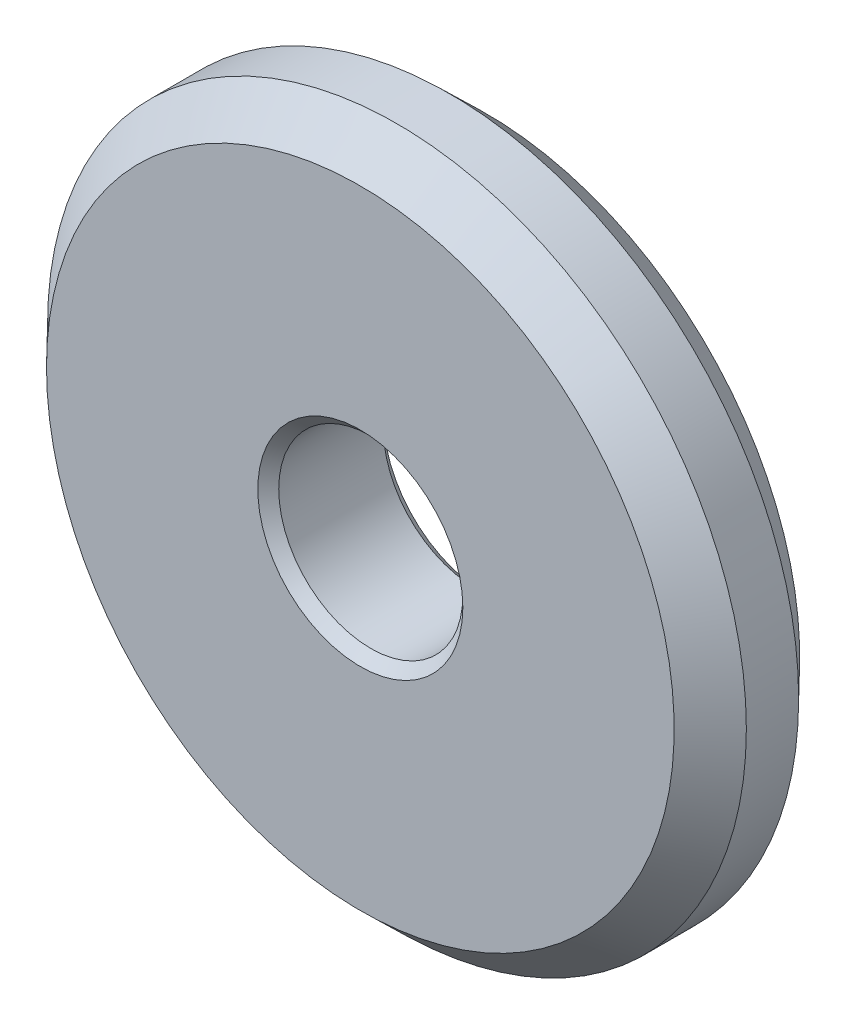
ISO-10303-21;
HEADER;
FILE_DESCRIPTION(('STEP AP214'),'2;1');
FILE_NAME('part.step','',(''),(''),'','','');
FILE_SCHEMA(('AUTOMOTIVE_DESIGN { 1 0 10303 214 1 1 1 1 }'));
ENDSEC;
DATA;
#1=APPLICATION_CONTEXT('core data for automotive mechanical design processes');
#2=APPLICATION_PROTOCOL_DEFINITION('international standard','automotive_design',2000,#1);
#3=PRODUCT_CONTEXT('',#1,'mechanical');
#4=PRODUCT('Part','Part','',(#3));
#5=PRODUCT_RELATED_PRODUCT_CATEGORY('part','',(#4));
#6=PRODUCT_DEFINITION_FORMATION('','',#4);
#7=PRODUCT_DEFINITION_CONTEXT('part definition',#1,'design');
#8=PRODUCT_DEFINITION('design','',#6,#7);
#9=PRODUCT_DEFINITION_SHAPE('','',#8);
#10=(LENGTH_UNIT() NAMED_UNIT(*) SI_UNIT(.MILLI.,.METRE.));
#11=(NAMED_UNIT(*) PLANE_ANGLE_UNIT() SI_UNIT($,.RADIAN.));
#12=(NAMED_UNIT(*) SI_UNIT($,.STERADIAN.) SOLID_ANGLE_UNIT());
#13=UNCERTAINTY_MEASURE_WITH_UNIT(LENGTH_MEASURE(1.E-05),#10,'distance_accuracy_value','');
#14=(GEOMETRIC_REPRESENTATION_CONTEXT(3) GLOBAL_UNCERTAINTY_ASSIGNED_CONTEXT((#13)) GLOBAL_UNIT_ASSIGNED_CONTEXT((#10,
#11,#12)) REPRESENTATION_CONTEXT('',''));
#15=CARTESIAN_POINT('',(0.,0.,0.));
#16=DIRECTION('',(0.,0.,1.));
#17=DIRECTION('',(1.,0.,0.));
#18=AXIS2_PLACEMENT_3D('',#15,#16,#17);
#19=CARTESIAN_POINT('',(0.,0.,0.));
#20=DIRECTION('',(0.,0.,-1.));
#21=DIRECTION('',(-1.,0.,0.));
#22=AXIS2_PLACEMENT_3D('',#19,#20,#21);
#23=CYLINDRICAL_SURFACE('',#22,4.4);
#24=CARTESIAN_POINT('',(0.,0.,5.5));
#25=DIRECTION('',(0.,0.,1.));
#26=DIRECTION('',(1.,0.,0.));
#27=AXIS2_PLACEMENT_3D('',#24,#25,#26);
#28=CIRCLE('',#27,4.4);
#29=CARTESIAN_POINT('',(4.4,0.,5.5));
#30=VERTEX_POINT('',#29);
#31=EDGE_CURVE('E46',#30,#30,#28,.T.);
#32=ORIENTED_EDGE('',*,*,#31,.T.);
#33=EDGE_LOOP('',(#32));
#34=FACE_BOUND('',#33,.T.);
#35=CARTESIAN_POINT('',(0.,0.,0.500000000000001));
#36=DIRECTION('',(0.,0.,-1.));
#37=DIRECTION('',(-1.,0.,0.));
#38=AXIS2_PLACEMENT_3D('',#35,#36,#37);
#39=CIRCLE('',#38,4.4);
#40=CARTESIAN_POINT('',(-4.4,0.,0.500000000000001));
#41=VERTEX_POINT('',#40);
#42=EDGE_CURVE('E50',#41,#41,#39,.T.);
#43=ORIENTED_EDGE('',*,*,#42,.T.);
#44=EDGE_LOOP('',(#43));
#45=FACE_BOUND('',#44,.T.);
#46=ADVANCED_FACE('F39',(#34,#45),#23,.F.);
#47=CARTESIAN_POINT('',(0.,4.4,0.));
#48=DIRECTION('',(0.,0.,-1.));
#49=DIRECTION('',(-1.,0.,0.));
#50=AXIS2_PLACEMENT_3D('',#47,#48,#49);
#51=PLANE('',#50);
#52=CARTESIAN_POINT('',(0.,0.,0.));
#53=DIRECTION('',(0.,0.,-1.));
#54=DIRECTION('',(-1.,0.,0.));
#55=AXIS2_PLACEMENT_3D('',#52,#53,#54);
#56=CIRCLE('',#55,4.9);
#57=CARTESIAN_POINT('',(-4.9,0.,0.));
#58=VERTEX_POINT('',#57);
#59=EDGE_CURVE('E10',#58,#58,#56,.F.);
#60=ORIENTED_EDGE('',*,*,#59,.T.);
#61=EDGE_LOOP('',(#60));
#62=FACE_BOUND('',#61,.T.);
#63=CARTESIAN_POINT('',(0.,0.,0.));
#64=DIRECTION('',(0.,0.,-1.));
#65=DIRECTION('',(-1.,0.,0.));
#66=AXIS2_PLACEMENT_3D('',#63,#64,#65);
#67=CIRCLE('',#66,15.);
#68=CARTESIAN_POINT('',(-15.,0.,0.));
#69=VERTEX_POINT('',#68);
#70=EDGE_CURVE('E59',#69,#69,#67,.T.);
#71=ORIENTED_EDGE('',*,*,#70,.T.);
#72=EDGE_LOOP('',(#71));
#73=FACE_BOUND('',#72,.T.);
#74=ADVANCED_FACE('F89',(#62,#73),#51,.T.);
#75=CARTESIAN_POINT('',(0.,0.,0.));
#76=DIRECTION('',(0.,0.,1.));
#77=DIRECTION('',(1.,0.,0.));
#78=AXIS2_PLACEMENT_3D('',#75,#76,#77);
#79=CONICAL_SURFACE('',#78,15.,0.770906424331948);
#80=CARTESIAN_POINT('',(0.,0.,1.75));
#81=DIRECTION('',(0.,0.,-1.));
#82=DIRECTION('',(-1.,0.,0.));
#83=AXIS2_PLACEMENT_3D('',#80,#81,#82);
#84=CIRCLE('',#83,16.7);
#85=CARTESIAN_POINT('',(-16.7,0.,1.75));
#86=VERTEX_POINT('',#85);
#87=EDGE_CURVE('E62',#86,#86,#84,.T.);
#88=ORIENTED_EDGE('',*,*,#87,.T.);
#89=EDGE_LOOP('',(#88));
#90=FACE_BOUND('',#89,.T.);
#91=ORIENTED_EDGE('',*,*,#70,.F.);
#92=EDGE_LOOP('',(#91));
#93=FACE_BOUND('',#92,.T.);
#94=ADVANCED_FACE('F93',(#90,#93),#79,.T.);
#95=CARTESIAN_POINT('',(0.,0.,0.));
#96=DIRECTION('',(0.,0.,-1.));
#97=DIRECTION('',(-1.,0.,0.));
#98=AXIS2_PLACEMENT_3D('',#95,#96,#97);
#99=CYLINDRICAL_SURFACE('',#98,16.7);
#100=CARTESIAN_POINT('',(0.,0.,4.25));
#101=DIRECTION('',(0.,0.,-1.));
#102=DIRECTION('',(-1.,0.,0.));
#103=AXIS2_PLACEMENT_3D('',#100,#101,#102);
#104=CIRCLE('',#103,16.7);
#105=CARTESIAN_POINT('',(-16.7,0.,4.25));
#106=VERTEX_POINT('',#105);
#107=EDGE_CURVE('E65',#106,#106,#104,.T.);
#108=ORIENTED_EDGE('',*,*,#107,.T.);
#109=EDGE_LOOP('',(#108));
#110=FACE_BOUND('',#109,.T.);
#111=ORIENTED_EDGE('',*,*,#87,.F.);
#112=EDGE_LOOP('',(#111));
#113=FACE_BOUND('',#112,.T.);
#114=ADVANCED_FACE('F86',(#110,#113),#99,.T.);
#115=CARTESIAN_POINT('',(0.,0.,4.25));
#116=DIRECTION('',(0.,0.,-1.));
#117=DIRECTION('',(-1.,0.,0.));
#118=AXIS2_PLACEMENT_3D('',#115,#116,#117);
#119=CONICAL_SURFACE('',#118,16.7,0.770906424331948);
#120=CARTESIAN_POINT('',(0.,0.,6.));
#121=DIRECTION('',(0.,0.,-1.));
#122=DIRECTION('',(-1.,0.,0.));
#123=AXIS2_PLACEMENT_3D('',#120,#121,#122);
#124=CIRCLE('',#123,15.);
#125=CARTESIAN_POINT('',(-15.,0.,6.));
#126=VERTEX_POINT('',#125);
#127=EDGE_CURVE('E68',#126,#126,#124,.T.);
#128=ORIENTED_EDGE('',*,*,#127,.T.);
#129=EDGE_LOOP('',(#128));
#130=FACE_BOUND('',#129,.T.);
#131=ORIENTED_EDGE('',*,*,#107,.F.);
#132=EDGE_LOOP('',(#131));
#133=FACE_BOUND('',#132,.T.);
#134=ADVANCED_FACE('F72',(#130,#133),#119,.T.);
#135=CARTESIAN_POINT('',(0.,15.,6.));
#136=DIRECTION('',(0.,0.,1.));
#137=DIRECTION('',(1.,0.,0.));
#138=AXIS2_PLACEMENT_3D('',#135,#136,#137);
#139=PLANE('',#138);
#140=CARTESIAN_POINT('',(0.,0.,6.));
#141=DIRECTION('',(0.,0.,1.));
#142=DIRECTION('',(1.,0.,0.));
#143=AXIS2_PLACEMENT_3D('',#140,#141,#142);
#144=CIRCLE('',#143,4.9);
#145=CARTESIAN_POINT('',(4.9,0.,6.));
#146=VERTEX_POINT('',#145);
#147=EDGE_CURVE('E54',#146,#146,#144,.F.);
#148=ORIENTED_EDGE('',*,*,#147,.T.);
#149=EDGE_LOOP('',(#148));
#150=FACE_BOUND('',#149,.T.);
#151=ORIENTED_EDGE('',*,*,#127,.F.);
#152=EDGE_LOOP('',(#151));
#153=FACE_BOUND('',#152,.T.);
#154=ADVANCED_FACE('F75',(#150,#153),#139,.T.);
#155=CARTESIAN_POINT('',(0.,0.,6.));
#156=DIRECTION('',(0.,0.,1.));
#157=DIRECTION('',(1.,0.,0.));
#158=AXIS2_PLACEMENT_3D('',#155,#156,#157);
#159=CONICAL_SURFACE('',#158,4.9,0.785398163397447);
#160=ORIENTED_EDGE('',*,*,#31,.F.);
#161=EDGE_LOOP('',(#160));
#162=FACE_BOUND('',#161,.T.);
#163=ORIENTED_EDGE('',*,*,#147,.F.);
#164=EDGE_LOOP('',(#163));
#165=FACE_BOUND('',#164,.T.);
#166=ADVANCED_FACE('F77',(#162,#165),#159,.F.);
#167=CARTESIAN_POINT('',(0.,0.,0.500000000000001));
#168=DIRECTION('',(0.,0.,-1.));
#169=DIRECTION('',(-1.,0.,0.));
#170=AXIS2_PLACEMENT_3D('',#167,#168,#169);
#171=CONICAL_SURFACE('',#170,4.4,0.785398163397449);
#172=ORIENTED_EDGE('',*,*,#59,.F.);
#173=EDGE_LOOP('',(#172));
#174=FACE_BOUND('',#173,.T.);
#175=ORIENTED_EDGE('',*,*,#42,.F.);
#176=EDGE_LOOP('',(#175));
#177=FACE_BOUND('',#176,.T.);
#178=ADVANCED_FACE('F41',(#174,#177),#171,.F.);
#179=CLOSED_SHELL('',(#46,#74,#94,#114,#134,#154,#166,#178));
#180=MANIFOLD_SOLID_BREP('B2',#179);
#181=ADVANCED_BREP_SHAPE_REPRESENTATION('',(#18,#180),#14);
#182=SHAPE_DEFINITION_REPRESENTATION(#9,#181);
ENDSEC;
END-ISO-10303-21;
